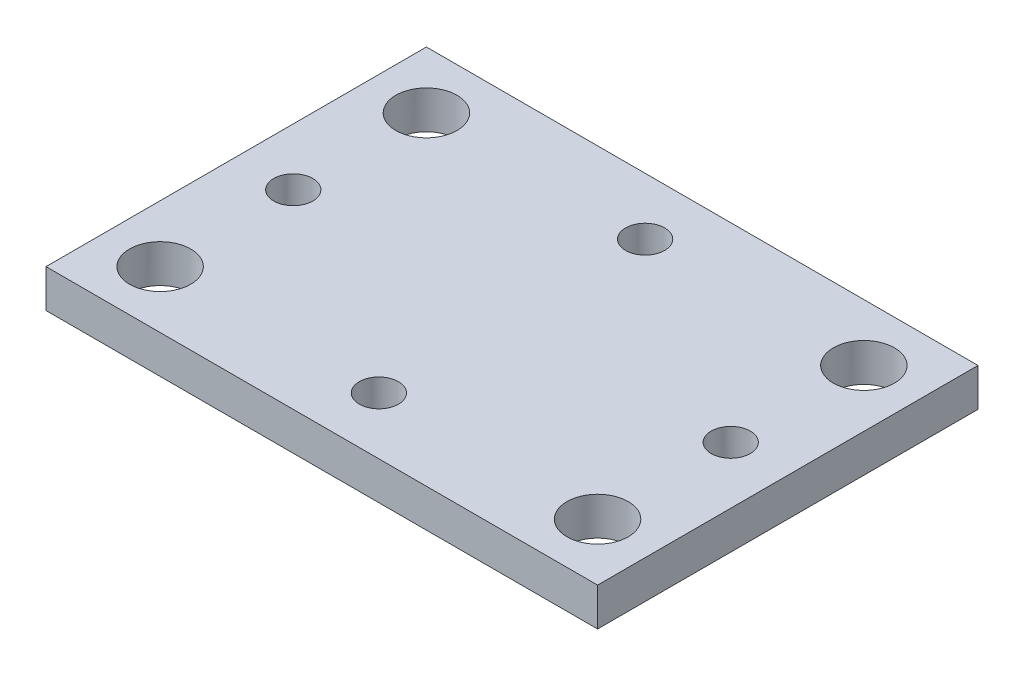
ISO-10303-21;
HEADER;
FILE_DESCRIPTION(('STEP AP214'),'2;1');
FILE_NAME('part.step','',(''),(''),'','','');
FILE_SCHEMA(('AUTOMOTIVE_DESIGN { 1 0 10303 214 1 1 1 1 }'));
ENDSEC;
DATA;
#1=APPLICATION_CONTEXT('core data for automotive mechanical design processes');
#2=APPLICATION_PROTOCOL_DEFINITION('international standard','automotive_design',2000,#1);
#3=PRODUCT_CONTEXT('',#1,'mechanical');
#4=PRODUCT('Part','Part','',(#3));
#5=PRODUCT_RELATED_PRODUCT_CATEGORY('part','',(#4));
#6=PRODUCT_DEFINITION_FORMATION('','',#4);
#7=PRODUCT_DEFINITION_CONTEXT('part definition',#1,'design');
#8=PRODUCT_DEFINITION('design','',#6,#7);
#9=PRODUCT_DEFINITION_SHAPE('','',#8);
#10=(LENGTH_UNIT() NAMED_UNIT(*) SI_UNIT(.MILLI.,.METRE.));
#11=(NAMED_UNIT(*) PLANE_ANGLE_UNIT() SI_UNIT($,.RADIAN.));
#12=(NAMED_UNIT(*) SI_UNIT($,.STERADIAN.) SOLID_ANGLE_UNIT());
#13=UNCERTAINTY_MEASURE_WITH_UNIT(LENGTH_MEASURE(1.E-05),#10,'distance_accuracy_value','');
#14=(GEOMETRIC_REPRESENTATION_CONTEXT(3) GLOBAL_UNCERTAINTY_ASSIGNED_CONTEXT((#13)) GLOBAL_UNIT_ASSIGNED_CONTEXT((#10,
#11,#12)) REPRESENTATION_CONTEXT('',''));
#15=CARTESIAN_POINT('',(0.,0.,0.));
#16=DIRECTION('',(0.,0.,1.));
#17=DIRECTION('',(1.,0.,0.));
#18=AXIS2_PLACEMENT_3D('',#15,#16,#17);
#19=CARTESIAN_POINT('',(0.,3.175,0.));
#20=DIRECTION('',(0.,-1.,0.));
#21=DIRECTION('',(0.,0.,-1.));
#22=AXIS2_PLACEMENT_3D('',#19,#20,#21);
#23=PLANE('',#22);
#24=CARTESIAN_POINT('',(0.,3.175,11.1125));
#25=DIRECTION('',(0.,1.,0.));
#26=DIRECTION('',(0.,0.,1.));
#27=AXIS2_PLACEMENT_3D('',#24,#25,#26);
#28=CIRCLE('',#27,1.63195);
#29=CARTESIAN_POINT('',(0.,3.175,12.74445));
#30=VERTEX_POINT('',#29);
#31=EDGE_CURVE('E149',#30,#30,#28,.T.);
#32=ORIENTED_EDGE('',*,*,#31,.F.);
#33=EDGE_LOOP('',(#32));
#34=FACE_BOUND('',#33,.T.);
#35=CARTESIAN_POINT('',(-18.25625,3.175,-11.1125));
#36=DIRECTION('',(0.,1.,0.));
#37=DIRECTION('',(0.,0.,1.));
#38=AXIS2_PLACEMENT_3D('',#35,#36,#37);
#39=CIRCLE('',#38,2.55269999999999);
#40=CARTESIAN_POINT('',(-18.25625,3.175,-8.55980000000001));
#41=VERTEX_POINT('',#40);
#42=EDGE_CURVE('E131',#41,#41,#39,.T.);
#43=ORIENTED_EDGE('',*,*,#42,.F.);
#44=EDGE_LOOP('',(#43));
#45=FACE_BOUND('',#44,.T.);
#46=CARTESIAN_POINT('',(-18.25625,3.175,11.1125));
#47=DIRECTION('',(0.,1.,0.));
#48=DIRECTION('',(0.,0.,1.));
#49=AXIS2_PLACEMENT_3D('',#46,#47,#48);
#50=CIRCLE('',#49,2.55269999999999);
#51=CARTESIAN_POINT('',(-18.25625,3.175,13.6652));
#52=VERTEX_POINT('',#51);
#53=EDGE_CURVE('E125',#52,#52,#50,.T.);
#54=ORIENTED_EDGE('',*,*,#53,.F.);
#55=EDGE_LOOP('',(#54));
#56=FACE_BOUND('',#55,.T.);
#57=CARTESIAN_POINT('',(18.25625,3.175,11.1125));
#58=DIRECTION('',(0.,1.,0.));
#59=DIRECTION('',(0.,0.,1.));
#60=AXIS2_PLACEMENT_3D('',#57,#58,#59);
#61=CIRCLE('',#60,2.55269999999999);
#62=CARTESIAN_POINT('',(18.25625,3.175,13.6652));
#63=VERTEX_POINT('',#62);
#64=EDGE_CURVE('E119',#63,#63,#61,.T.);
#65=ORIENTED_EDGE('',*,*,#64,.F.);
#66=EDGE_LOOP('',(#65));
#67=FACE_BOUND('',#66,.T.);
#68=CARTESIAN_POINT('',(18.25625,3.175,-11.1125));
#69=DIRECTION('',(0.,1.,0.));
#70=DIRECTION('',(0.,0.,1.));
#71=AXIS2_PLACEMENT_3D('',#68,#69,#70);
#72=CIRCLE('',#71,2.55269999999999);
#73=CARTESIAN_POINT('',(18.25625,3.175,-8.55980000000001));
#74=VERTEX_POINT('',#73);
#75=EDGE_CURVE('E113',#74,#74,#72,.T.);
#76=ORIENTED_EDGE('',*,*,#75,.F.);
#77=EDGE_LOOP('',(#76));
#78=FACE_BOUND('',#77,.T.);
#79=DIRECTION('',(0.,0.,1.));
#80=VECTOR('',#79,1.);
#81=CARTESIAN_POINT('',(-23.01875,3.175,15.875));
#82=LINE('',#81,#80);
#83=CARTESIAN_POINT('',(-23.01875,3.175,-15.875));
#84=VERTEX_POINT('',#83);
#85=CARTESIAN_POINT('',(-23.01875,3.175,15.875));
#86=VERTEX_POINT('',#85);
#87=EDGE_CURVE('E85',#84,#86,#82,.T.);
#88=ORIENTED_EDGE('',*,*,#87,.T.);
#89=DIRECTION('',(1.,0.,0.));
#90=VECTOR('',#89,1.);
#91=CARTESIAN_POINT('',(-23.01875,3.175,15.875));
#92=LINE('',#91,#90);
#93=CARTESIAN_POINT('',(23.01875,3.175,15.875));
#94=VERTEX_POINT('',#93);
#95=EDGE_CURVE('E80',#86,#94,#92,.T.);
#96=ORIENTED_EDGE('',*,*,#95,.T.);
#97=DIRECTION('',(0.,0.,-1.));
#98=VECTOR('',#97,1.);
#99=CARTESIAN_POINT('',(23.01875,3.175,15.875));
#100=LINE('',#99,#98);
#101=CARTESIAN_POINT('',(23.01875,3.175,-15.875));
#102=VERTEX_POINT('',#101);
#103=EDGE_CURVE('E83',#94,#102,#100,.T.);
#104=ORIENTED_EDGE('',*,*,#103,.T.);
#105=DIRECTION('',(-1.,0.,0.));
#106=VECTOR('',#105,1.);
#107=CARTESIAN_POINT('',(-23.01875,3.175,-15.875));
#108=LINE('',#107,#106);
#109=EDGE_CURVE('E50',#102,#84,#108,.T.);
#110=ORIENTED_EDGE('',*,*,#109,.T.);
#111=EDGE_LOOP('',(#88,#96,#104,#110));
#112=FACE_BOUND('',#111,.T.);
#113=CARTESIAN_POINT('',(18.25625,3.175,0.));
#114=DIRECTION('',(0.,1.,0.));
#115=DIRECTION('',(0.,0.,1.));
#116=AXIS2_PLACEMENT_3D('',#113,#114,#115);
#117=CIRCLE('',#116,1.63195);
#118=CARTESIAN_POINT('',(18.25625,3.175,1.63195));
#119=VERTEX_POINT('',#118);
#120=EDGE_CURVE('E137',#119,#119,#117,.T.);
#121=ORIENTED_EDGE('',*,*,#120,.F.);
#122=EDGE_LOOP('',(#121));
#123=FACE_BOUND('',#122,.T.);
#124=CARTESIAN_POINT('',(-18.25625,3.175,0.));
#125=DIRECTION('',(0.,1.,0.));
#126=DIRECTION('',(0.,0.,1.));
#127=AXIS2_PLACEMENT_3D('',#124,#125,#126);
#128=CIRCLE('',#127,1.63195);
#129=CARTESIAN_POINT('',(-18.25625,3.175,1.63195));
#130=VERTEX_POINT('',#129);
#131=EDGE_CURVE('E143',#130,#130,#128,.T.);
#132=ORIENTED_EDGE('',*,*,#131,.F.);
#133=EDGE_LOOP('',(#132));
#134=FACE_BOUND('',#133,.T.);
#135=CARTESIAN_POINT('',(0.,3.175,-11.1125));
#136=DIRECTION('',(0.,1.,0.));
#137=DIRECTION('',(0.,0.,1.));
#138=AXIS2_PLACEMENT_3D('',#135,#136,#137);
#139=CIRCLE('',#138,1.63195);
#140=CARTESIAN_POINT('',(0.,3.175,-9.48055));
#141=VERTEX_POINT('',#140);
#142=EDGE_CURVE('E155',#141,#141,#139,.T.);
#143=ORIENTED_EDGE('',*,*,#142,.F.);
#144=EDGE_LOOP('',(#143));
#145=FACE_BOUND('',#144,.T.);
#146=ADVANCED_FACE('F33',(#34,#45,#56,#67,#78,#112,#123,#134,#145),#23,.F.);
#147=CARTESIAN_POINT('',(-23.01875,3.175,15.875));
#148=DIRECTION('',(1.,0.,0.));
#149=DIRECTION('',(0.,0.,-1.));
#150=AXIS2_PLACEMENT_3D('',#147,#148,#149);
#151=PLANE('',#150);
#152=DIRECTION('',(0.,0.,1.));
#153=VECTOR('',#152,1.);
#154=CARTESIAN_POINT('',(-23.01875,0.,15.875));
#155=LINE('',#154,#153);
#156=CARTESIAN_POINT('',(-23.01875,0.,-15.875));
#157=VERTEX_POINT('',#156);
#158=CARTESIAN_POINT('',(-23.01875,0.,15.875));
#159=VERTEX_POINT('',#158);
#160=EDGE_CURVE('E97',#157,#159,#155,.T.);
#161=ORIENTED_EDGE('',*,*,#160,.T.);
#162=DIRECTION('',(0.,-1.,0.));
#163=VECTOR('',#162,1.);
#164=CARTESIAN_POINT('',(-23.01875,3.175,15.875));
#165=LINE('',#164,#163);
#166=EDGE_CURVE('E11',#86,#159,#165,.T.);
#167=ORIENTED_EDGE('',*,*,#166,.F.);
#168=ORIENTED_EDGE('',*,*,#87,.F.);
#169=DIRECTION('',(0.,-1.,0.));
#170=VECTOR('',#169,1.);
#171=CARTESIAN_POINT('',(-23.01875,3.175,-15.875));
#172=LINE('',#171,#170);
#173=EDGE_CURVE('E93',#84,#157,#172,.T.);
#174=ORIENTED_EDGE('',*,*,#173,.T.);
#175=EDGE_LOOP('',(#161,#167,#168,#174));
#176=FACE_BOUND('',#175,.T.);
#177=ADVANCED_FACE('F35',(#176),#151,.F.);
#178=CARTESIAN_POINT('',(-23.01875,3.175,15.875));
#179=DIRECTION('',(0.,0.,-1.));
#180=DIRECTION('',(-1.,0.,0.));
#181=AXIS2_PLACEMENT_3D('',#178,#179,#180);
#182=PLANE('',#181);
#183=DIRECTION('',(1.,0.,0.));
#184=VECTOR('',#183,1.);
#185=CARTESIAN_POINT('',(-23.01875,0.,15.875));
#186=LINE('',#185,#184);
#187=CARTESIAN_POINT('',(23.01875,0.,15.875));
#188=VERTEX_POINT('',#187);
#189=EDGE_CURVE('E89',#159,#188,#186,.T.);
#190=ORIENTED_EDGE('',*,*,#189,.T.);
#191=DIRECTION('',(0.,-1.,0.));
#192=VECTOR('',#191,1.);
#193=CARTESIAN_POINT('',(23.01875,3.175,15.875));
#194=LINE('',#193,#192);
#195=EDGE_CURVE('E42',#94,#188,#194,.T.);
#196=ORIENTED_EDGE('',*,*,#195,.F.);
#197=ORIENTED_EDGE('',*,*,#95,.F.);
#198=ORIENTED_EDGE('',*,*,#166,.T.);
#199=EDGE_LOOP('',(#190,#196,#197,#198));
#200=FACE_BOUND('',#199,.T.);
#201=ADVANCED_FACE('F88',(#200),#182,.F.);
#202=CARTESIAN_POINT('',(23.01875,3.175,15.875));
#203=DIRECTION('',(-1.,0.,0.));
#204=DIRECTION('',(0.,0.,1.));
#205=AXIS2_PLACEMENT_3D('',#202,#203,#204);
#206=PLANE('',#205);
#207=DIRECTION('',(0.,0.,-1.));
#208=VECTOR('',#207,1.);
#209=CARTESIAN_POINT('',(23.01875,0.,15.875));
#210=LINE('',#209,#208);
#211=CARTESIAN_POINT('',(23.01875,0.,-15.875));
#212=VERTEX_POINT('',#211);
#213=EDGE_CURVE('E67',#188,#212,#210,.T.);
#214=ORIENTED_EDGE('',*,*,#213,.T.);
#215=DIRECTION('',(0.,-1.,0.));
#216=VECTOR('',#215,1.);
#217=CARTESIAN_POINT('',(23.01875,3.175,-15.875));
#218=LINE('',#217,#216);
#219=EDGE_CURVE('E90',#102,#212,#218,.T.);
#220=ORIENTED_EDGE('',*,*,#219,.F.);
#221=ORIENTED_EDGE('',*,*,#103,.F.);
#222=ORIENTED_EDGE('',*,*,#195,.T.);
#223=EDGE_LOOP('',(#214,#220,#221,#222));
#224=FACE_BOUND('',#223,.T.);
#225=ADVANCED_FACE('F91',(#224),#206,.F.);
#226=CARTESIAN_POINT('',(-23.01875,3.175,-15.875));
#227=DIRECTION('',(0.,0.,1.));
#228=DIRECTION('',(1.,0.,0.));
#229=AXIS2_PLACEMENT_3D('',#226,#227,#228);
#230=PLANE('',#229);
#231=DIRECTION('',(-1.,0.,0.));
#232=VECTOR('',#231,1.);
#233=CARTESIAN_POINT('',(-23.01875,0.,-15.875));
#234=LINE('',#233,#232);
#235=EDGE_CURVE('E73',#212,#157,#234,.T.);
#236=ORIENTED_EDGE('',*,*,#235,.T.);
#237=ORIENTED_EDGE('',*,*,#173,.F.);
#238=ORIENTED_EDGE('',*,*,#109,.F.);
#239=ORIENTED_EDGE('',*,*,#219,.T.);
#240=EDGE_LOOP('',(#236,#237,#238,#239));
#241=FACE_BOUND('',#240,.T.);
#242=ADVANCED_FACE('F105',(#241),#230,.F.);
#243=CARTESIAN_POINT('',(0.,0.,0.));
#244=DIRECTION('',(0.,-1.,0.));
#245=DIRECTION('',(0.,0.,-1.));
#246=AXIS2_PLACEMENT_3D('',#243,#244,#245);
#247=PLANE('',#246);
#248=CARTESIAN_POINT('',(0.,0.,-11.1125));
#249=DIRECTION('',(0.,-1.,0.));
#250=DIRECTION('',(0.,0.,-1.));
#251=AXIS2_PLACEMENT_3D('',#248,#249,#250);
#252=CIRCLE('',#251,1.63195);
#253=CARTESIAN_POINT('',(0.,0.,-12.74445));
#254=VERTEX_POINT('',#253);
#255=EDGE_CURVE('E152',#254,#254,#252,.T.);
#256=ORIENTED_EDGE('',*,*,#255,.F.);
#257=EDGE_LOOP('',(#256));
#258=FACE_BOUND('',#257,.T.);
#259=CARTESIAN_POINT('',(0.,0.,11.1125));
#260=DIRECTION('',(0.,-1.,0.));
#261=DIRECTION('',(0.,0.,-1.));
#262=AXIS2_PLACEMENT_3D('',#259,#260,#261);
#263=CIRCLE('',#262,1.63195);
#264=CARTESIAN_POINT('',(0.,0.,9.48055));
#265=VERTEX_POINT('',#264);
#266=EDGE_CURVE('E146',#265,#265,#263,.T.);
#267=ORIENTED_EDGE('',*,*,#266,.F.);
#268=EDGE_LOOP('',(#267));
#269=FACE_BOUND('',#268,.T.);
#270=CARTESIAN_POINT('',(-18.25625,0.,0.));
#271=DIRECTION('',(0.,-1.,0.));
#272=DIRECTION('',(0.,0.,-1.));
#273=AXIS2_PLACEMENT_3D('',#270,#271,#272);
#274=CIRCLE('',#273,1.63195);
#275=CARTESIAN_POINT('',(-18.25625,0.,-1.63195));
#276=VERTEX_POINT('',#275);
#277=EDGE_CURVE('E140',#276,#276,#274,.T.);
#278=ORIENTED_EDGE('',*,*,#277,.F.);
#279=EDGE_LOOP('',(#278));
#280=FACE_BOUND('',#279,.T.);
#281=CARTESIAN_POINT('',(18.25625,0.,0.));
#282=DIRECTION('',(0.,-1.,0.));
#283=DIRECTION('',(0.,0.,-1.));
#284=AXIS2_PLACEMENT_3D('',#281,#282,#283);
#285=CIRCLE('',#284,1.63195);
#286=CARTESIAN_POINT('',(18.25625,0.,-1.63195));
#287=VERTEX_POINT('',#286);
#288=EDGE_CURVE('E134',#287,#287,#285,.T.);
#289=ORIENTED_EDGE('',*,*,#288,.F.);
#290=EDGE_LOOP('',(#289));
#291=FACE_BOUND('',#290,.T.);
#292=CARTESIAN_POINT('',(-18.25625,0.,-11.1125));
#293=DIRECTION('',(0.,-1.,0.));
#294=DIRECTION('',(0.,0.,-1.));
#295=AXIS2_PLACEMENT_3D('',#292,#293,#294);
#296=CIRCLE('',#295,2.55269999999999);
#297=CARTESIAN_POINT('',(-18.25625,0.,-13.6652));
#298=VERTEX_POINT('',#297);
#299=EDGE_CURVE('E128',#298,#298,#296,.T.);
#300=ORIENTED_EDGE('',*,*,#299,.F.);
#301=EDGE_LOOP('',(#300));
#302=FACE_BOUND('',#301,.T.);
#303=CARTESIAN_POINT('',(-18.25625,0.,11.1125));
#304=DIRECTION('',(0.,-1.,0.));
#305=DIRECTION('',(0.,0.,-1.));
#306=AXIS2_PLACEMENT_3D('',#303,#304,#305);
#307=CIRCLE('',#306,2.55269999999999);
#308=CARTESIAN_POINT('',(-18.25625,0.,8.5598));
#309=VERTEX_POINT('',#308);
#310=EDGE_CURVE('E122',#309,#309,#307,.T.);
#311=ORIENTED_EDGE('',*,*,#310,.F.);
#312=EDGE_LOOP('',(#311));
#313=FACE_BOUND('',#312,.T.);
#314=CARTESIAN_POINT('',(18.25625,0.,11.1125));
#315=DIRECTION('',(0.,-1.,0.));
#316=DIRECTION('',(0.,0.,-1.));
#317=AXIS2_PLACEMENT_3D('',#314,#315,#316);
#318=CIRCLE('',#317,2.55269999999999);
#319=CARTESIAN_POINT('',(18.25625,0.,8.5598));
#320=VERTEX_POINT('',#319);
#321=EDGE_CURVE('E116',#320,#320,#318,.T.);
#322=ORIENTED_EDGE('',*,*,#321,.F.);
#323=EDGE_LOOP('',(#322));
#324=FACE_BOUND('',#323,.T.);
#325=CARTESIAN_POINT('',(18.25625,0.,-11.1125));
#326=DIRECTION('',(0.,-1.,0.));
#327=DIRECTION('',(0.,0.,-1.));
#328=AXIS2_PLACEMENT_3D('',#325,#326,#327);
#329=CIRCLE('',#328,2.55269999999999);
#330=CARTESIAN_POINT('',(18.25625,0.,-13.6652));
#331=VERTEX_POINT('',#330);
#332=EDGE_CURVE('E100',#331,#331,#329,.T.);
#333=ORIENTED_EDGE('',*,*,#332,.F.);
#334=EDGE_LOOP('',(#333));
#335=FACE_BOUND('',#334,.T.);
#336=ORIENTED_EDGE('',*,*,#160,.F.);
#337=ORIENTED_EDGE('',*,*,#235,.F.);
#338=ORIENTED_EDGE('',*,*,#213,.F.);
#339=ORIENTED_EDGE('',*,*,#189,.F.);
#340=EDGE_LOOP('',(#336,#337,#338,#339));
#341=FACE_BOUND('',#340,.T.);
#342=ADVANCED_FACE('F108',(#258,#269,#280,#291,#302,#313,#324,#335,#341),#247,.T.);
#343=CARTESIAN_POINT('',(18.25625,3.175,-11.1125));
#344=DIRECTION('',(0.,1.,0.));
#345=DIRECTION('',(0.,0.,1.));
#346=AXIS2_PLACEMENT_3D('',#343,#344,#345);
#347=CYLINDRICAL_SURFACE('',#346,2.55269999999999);
#348=ORIENTED_EDGE('',*,*,#75,.T.);
#349=EDGE_LOOP('',(#348));
#350=FACE_BOUND('',#349,.T.);
#351=ORIENTED_EDGE('',*,*,#332,.T.);
#352=EDGE_LOOP('',(#351));
#353=FACE_BOUND('',#352,.T.);
#354=ADVANCED_FACE('F172',(#350,#353),#347,.F.);
#355=CARTESIAN_POINT('',(18.25625,3.175,11.1125));
#356=DIRECTION('',(0.,1.,0.));
#357=DIRECTION('',(0.,0.,1.));
#358=AXIS2_PLACEMENT_3D('',#355,#356,#357);
#359=CYLINDRICAL_SURFACE('',#358,2.55269999999999);
#360=ORIENTED_EDGE('',*,*,#64,.T.);
#361=EDGE_LOOP('',(#360));
#362=FACE_BOUND('',#361,.T.);
#363=ORIENTED_EDGE('',*,*,#321,.T.);
#364=EDGE_LOOP('',(#363));
#365=FACE_BOUND('',#364,.T.);
#366=ADVANCED_FACE('F204',(#362,#365),#359,.F.);
#367=CARTESIAN_POINT('',(-18.25625,3.175,11.1125));
#368=DIRECTION('',(0.,1.,0.));
#369=DIRECTION('',(0.,0.,1.));
#370=AXIS2_PLACEMENT_3D('',#367,#368,#369);
#371=CYLINDRICAL_SURFACE('',#370,2.55269999999999);
#372=ORIENTED_EDGE('',*,*,#53,.T.);
#373=EDGE_LOOP('',(#372));
#374=FACE_BOUND('',#373,.T.);
#375=ORIENTED_EDGE('',*,*,#310,.T.);
#376=EDGE_LOOP('',(#375));
#377=FACE_BOUND('',#376,.T.);
#378=ADVANCED_FACE('F211',(#374,#377),#371,.F.);
#379=CARTESIAN_POINT('',(-18.25625,3.175,-11.1125));
#380=DIRECTION('',(0.,1.,0.));
#381=DIRECTION('',(0.,0.,1.));
#382=AXIS2_PLACEMENT_3D('',#379,#380,#381);
#383=CYLINDRICAL_SURFACE('',#382,2.55269999999999);
#384=ORIENTED_EDGE('',*,*,#42,.T.);
#385=EDGE_LOOP('',(#384));
#386=FACE_BOUND('',#385,.T.);
#387=ORIENTED_EDGE('',*,*,#299,.T.);
#388=EDGE_LOOP('',(#387));
#389=FACE_BOUND('',#388,.T.);
#390=ADVANCED_FACE('F218',(#386,#389),#383,.F.);
#391=CARTESIAN_POINT('',(18.25625,3.175,0.));
#392=DIRECTION('',(0.,1.,0.));
#393=DIRECTION('',(0.,0.,1.));
#394=AXIS2_PLACEMENT_3D('',#391,#392,#393);
#395=CYLINDRICAL_SURFACE('',#394,1.63195);
#396=ORIENTED_EDGE('',*,*,#120,.T.);
#397=EDGE_LOOP('',(#396));
#398=FACE_BOUND('',#397,.T.);
#399=ORIENTED_EDGE('',*,*,#288,.T.);
#400=EDGE_LOOP('',(#399));
#401=FACE_BOUND('',#400,.T.);
#402=ADVANCED_FACE('F226',(#398,#401),#395,.F.);
#403=CARTESIAN_POINT('',(-18.25625,3.175,0.));
#404=DIRECTION('',(0.,1.,0.));
#405=DIRECTION('',(0.,0.,1.));
#406=AXIS2_PLACEMENT_3D('',#403,#404,#405);
#407=CYLINDRICAL_SURFACE('',#406,1.63195);
#408=ORIENTED_EDGE('',*,*,#131,.T.);
#409=EDGE_LOOP('',(#408));
#410=FACE_BOUND('',#409,.T.);
#411=ORIENTED_EDGE('',*,*,#277,.T.);
#412=EDGE_LOOP('',(#411));
#413=FACE_BOUND('',#412,.T.);
#414=ADVANCED_FACE('F233',(#410,#413),#407,.F.);
#415=CARTESIAN_POINT('',(0.,3.175,11.1125));
#416=DIRECTION('',(0.,1.,0.));
#417=DIRECTION('',(0.,0.,1.));
#418=AXIS2_PLACEMENT_3D('',#415,#416,#417);
#419=CYLINDRICAL_SURFACE('',#418,1.63195);
#420=ORIENTED_EDGE('',*,*,#31,.T.);
#421=EDGE_LOOP('',(#420));
#422=FACE_BOUND('',#421,.T.);
#423=ORIENTED_EDGE('',*,*,#266,.T.);
#424=EDGE_LOOP('',(#423));
#425=FACE_BOUND('',#424,.T.);
#426=ADVANCED_FACE('F241',(#422,#425),#419,.F.);
#427=CARTESIAN_POINT('',(0.,3.175,-11.1125));
#428=DIRECTION('',(0.,1.,0.));
#429=DIRECTION('',(0.,0.,1.));
#430=AXIS2_PLACEMENT_3D('',#427,#428,#429);
#431=CYLINDRICAL_SURFACE('',#430,1.63195);
#432=ORIENTED_EDGE('',*,*,#142,.T.);
#433=EDGE_LOOP('',(#432));
#434=FACE_BOUND('',#433,.T.);
#435=ORIENTED_EDGE('',*,*,#255,.T.);
#436=EDGE_LOOP('',(#435));
#437=FACE_BOUND('',#436,.T.);
#438=ADVANCED_FACE('F159',(#434,#437),#431,.F.);
#439=CLOSED_SHELL('',(#146,#177,#201,#225,#242,#342,#354,#366,#378,#390,#402,#414,#426,#438));
#440=MANIFOLD_SOLID_BREP('B2',#439);
#441=ADVANCED_BREP_SHAPE_REPRESENTATION('',(#18,#440),#14);
#442=SHAPE_DEFINITION_REPRESENTATION(#9,#441);
ENDSEC;
END-ISO-10303-21;
